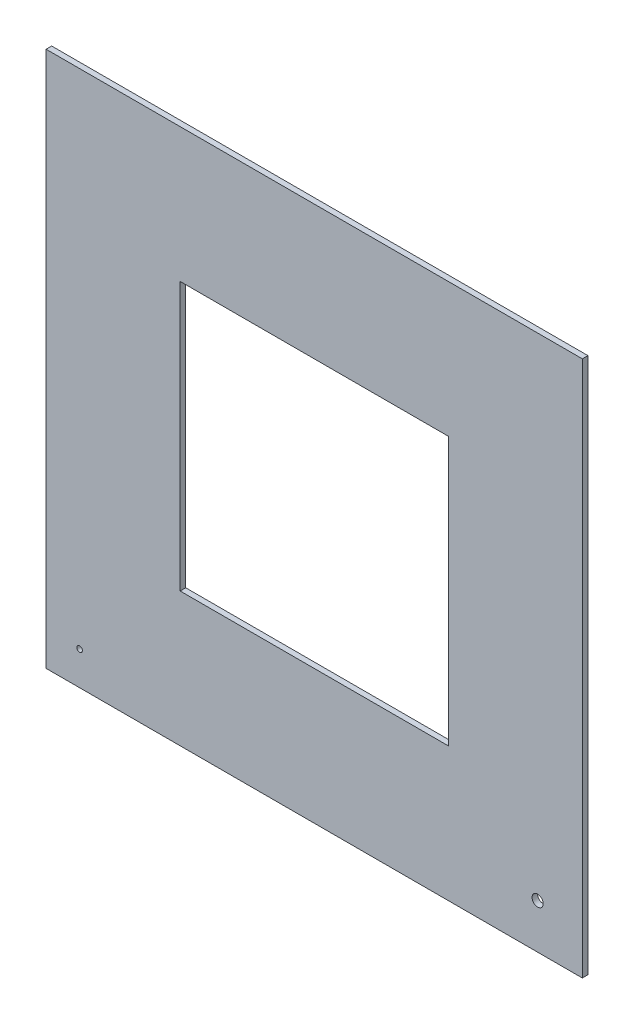
ISO-10303-21;
HEADER;
FILE_DESCRIPTION(('STEP AP214'),'2;1');
FILE_NAME('part.step','',(''),(''),'','','');
FILE_SCHEMA(('AUTOMOTIVE_DESIGN { 1 0 10303 214 1 1 1 1 }'));
ENDSEC;
DATA;
#1=APPLICATION_CONTEXT('core data for automotive mechanical design processes');
#2=APPLICATION_PROTOCOL_DEFINITION('international standard','automotive_design',2000,#1);
#3=PRODUCT_CONTEXT('',#1,'mechanical');
#4=PRODUCT('Part','Part','',(#3));
#5=PRODUCT_RELATED_PRODUCT_CATEGORY('part','',(#4));
#6=PRODUCT_DEFINITION_FORMATION('','',#4);
#7=PRODUCT_DEFINITION_CONTEXT('part definition',#1,'design');
#8=PRODUCT_DEFINITION('design','',#6,#7);
#9=PRODUCT_DEFINITION_SHAPE('','',#8);
#10=(LENGTH_UNIT() NAMED_UNIT(*) SI_UNIT(.MILLI.,.METRE.));
#11=(NAMED_UNIT(*) PLANE_ANGLE_UNIT() SI_UNIT($,.RADIAN.));
#12=(NAMED_UNIT(*) SI_UNIT($,.STERADIAN.) SOLID_ANGLE_UNIT());
#13=UNCERTAINTY_MEASURE_WITH_UNIT(LENGTH_MEASURE(1.E-05),#10,'distance_accuracy_value','');
#14=(GEOMETRIC_REPRESENTATION_CONTEXT(3) GLOBAL_UNCERTAINTY_ASSIGNED_CONTEXT((#13)) GLOBAL_UNIT_ASSIGNED_CONTEXT((#10,
#11,#12)) REPRESENTATION_CONTEXT('',''));
#15=CARTESIAN_POINT('',(0.,0.,0.));
#16=DIRECTION('',(0.,0.,1.));
#17=DIRECTION('',(1.,0.,0.));
#18=AXIS2_PLACEMENT_3D('',#15,#16,#17);
#19=CARTESIAN_POINT('',(304.8,304.8,6.35));
#20=DIRECTION('',(-1.,0.,0.));
#21=DIRECTION('',(0.,-1.,0.));
#22=AXIS2_PLACEMENT_3D('',#19,#20,#21);
#23=PLANE('',#22);
#24=DIRECTION('',(0.,1.,0.));
#25=VECTOR('',#24,1.);
#26=CARTESIAN_POINT('',(304.8,304.8,0.));
#27=LINE('',#26,#25);
#28=CARTESIAN_POINT('',(304.8,-304.8,0.));
#29=VERTEX_POINT('',#28);
#30=CARTESIAN_POINT('',(304.8,304.8,0.));
#31=VERTEX_POINT('',#30);
#32=EDGE_CURVE('E159',#29,#31,#27,.T.);
#33=ORIENTED_EDGE('',*,*,#32,.T.);
#34=DIRECTION('',(0.,0.,-1.));
#35=VECTOR('',#34,1.);
#36=CARTESIAN_POINT('',(304.8,304.8,6.35));
#37=LINE('',#36,#35);
#38=CARTESIAN_POINT('',(304.8,304.8,6.35));
#39=VERTEX_POINT('',#38);
#40=EDGE_CURVE('E11',#39,#31,#37,.T.);
#41=ORIENTED_EDGE('',*,*,#40,.F.);
#42=DIRECTION('',(0.,1.,0.));
#43=VECTOR('',#42,1.);
#44=CARTESIAN_POINT('',(304.8,304.8,6.35));
#45=LINE('',#44,#43);
#46=CARTESIAN_POINT('',(304.8,-304.8,6.35));
#47=VERTEX_POINT('',#46);
#48=EDGE_CURVE('E163',#47,#39,#45,.T.);
#49=ORIENTED_EDGE('',*,*,#48,.F.);
#50=DIRECTION('',(0.,0.,-1.));
#51=VECTOR('',#50,1.);
#52=CARTESIAN_POINT('',(304.8,-304.8,6.35));
#53=LINE('',#52,#51);
#54=EDGE_CURVE('E177',#47,#29,#53,.T.);
#55=ORIENTED_EDGE('',*,*,#54,.T.);
#56=EDGE_LOOP('',(#33,#41,#49,#55));
#57=FACE_BOUND('',#56,.T.);
#58=ADVANCED_FACE('F38',(#57),#23,.F.);
#59=CARTESIAN_POINT('',(-304.8,304.8,6.35));
#60=DIRECTION('',(0.,-1.,0.));
#61=DIRECTION('',(0.,0.,-1.));
#62=AXIS2_PLACEMENT_3D('',#59,#60,#61);
#63=PLANE('',#62);
#64=DIRECTION('',(-1.,0.,0.));
#65=VECTOR('',#64,1.);
#66=CARTESIAN_POINT('',(-304.8,304.8,0.));
#67=LINE('',#66,#65);
#68=CARTESIAN_POINT('',(-304.8,304.8,0.));
#69=VERTEX_POINT('',#68);
#70=EDGE_CURVE('E181',#31,#69,#67,.T.);
#71=ORIENTED_EDGE('',*,*,#70,.T.);
#72=DIRECTION('',(0.,0.,-1.));
#73=VECTOR('',#72,1.);
#74=CARTESIAN_POINT('',(-304.8,304.8,6.35));
#75=LINE('',#74,#73);
#76=CARTESIAN_POINT('',(-304.8,304.8,6.35));
#77=VERTEX_POINT('',#76);
#78=EDGE_CURVE('E46',#77,#69,#75,.T.);
#79=ORIENTED_EDGE('',*,*,#78,.F.);
#80=DIRECTION('',(-1.,0.,0.));
#81=VECTOR('',#80,1.);
#82=CARTESIAN_POINT('',(-304.8,304.8,6.35));
#83=LINE('',#82,#81);
#84=EDGE_CURVE('E167',#39,#77,#83,.T.);
#85=ORIENTED_EDGE('',*,*,#84,.F.);
#86=ORIENTED_EDGE('',*,*,#40,.T.);
#87=EDGE_LOOP('',(#71,#79,#85,#86));
#88=FACE_BOUND('',#87,.T.);
#89=ADVANCED_FACE('F216',(#88),#63,.F.);
#90=CARTESIAN_POINT('',(-304.8,304.8,6.35));
#91=DIRECTION('',(1.,0.,0.));
#92=DIRECTION('',(0.,1.,0.));
#93=AXIS2_PLACEMENT_3D('',#90,#91,#92);
#94=PLANE('',#93);
#95=DIRECTION('',(0.,-1.,0.));
#96=VECTOR('',#95,1.);
#97=CARTESIAN_POINT('',(-304.8,304.8,0.));
#98=LINE('',#97,#96);
#99=CARTESIAN_POINT('',(-304.8,-304.8,0.));
#100=VERTEX_POINT('',#99);
#101=EDGE_CURVE('E184',#69,#100,#98,.T.);
#102=ORIENTED_EDGE('',*,*,#101,.T.);
#103=DIRECTION('',(0.,0.,-1.));
#104=VECTOR('',#103,1.);
#105=CARTESIAN_POINT('',(-304.8,-304.8,6.35));
#106=LINE('',#105,#104);
#107=CARTESIAN_POINT('',(-304.8,-304.8,6.35));
#108=VERTEX_POINT('',#107);
#109=EDGE_CURVE('E192',#108,#100,#106,.T.);
#110=ORIENTED_EDGE('',*,*,#109,.F.);
#111=DIRECTION('',(0.,-1.,0.));
#112=VECTOR('',#111,1.);
#113=CARTESIAN_POINT('',(-304.8,304.8,6.35));
#114=LINE('',#113,#112);
#115=EDGE_CURVE('E171',#77,#108,#114,.T.);
#116=ORIENTED_EDGE('',*,*,#115,.F.);
#117=ORIENTED_EDGE('',*,*,#78,.T.);
#118=EDGE_LOOP('',(#102,#110,#116,#117));
#119=FACE_BOUND('',#118,.T.);
#120=ADVANCED_FACE('F201',(#119),#94,.F.);
#121=CARTESIAN_POINT('',(-304.8,-304.8,6.35));
#122=DIRECTION('',(0.,1.,0.));
#123=DIRECTION('',(0.,0.,1.));
#124=AXIS2_PLACEMENT_3D('',#121,#122,#123);
#125=PLANE('',#124);
#126=DIRECTION('',(1.,0.,0.));
#127=VECTOR('',#126,1.);
#128=CARTESIAN_POINT('',(-304.8,-304.8,0.));
#129=LINE('',#128,#127);
#130=EDGE_CURVE('E168',#100,#29,#129,.T.);
#131=ORIENTED_EDGE('',*,*,#130,.T.);
#132=ORIENTED_EDGE('',*,*,#54,.F.);
#133=DIRECTION('',(1.,0.,0.));
#134=VECTOR('',#133,1.);
#135=CARTESIAN_POINT('',(-304.8,-304.8,6.35));
#136=LINE('',#135,#134);
#137=EDGE_CURVE('E174',#108,#47,#136,.T.);
#138=ORIENTED_EDGE('',*,*,#137,.F.);
#139=ORIENTED_EDGE('',*,*,#109,.T.);
#140=EDGE_LOOP('',(#131,#132,#138,#139));
#141=FACE_BOUND('',#140,.T.);
#142=ADVANCED_FACE('F209',(#141),#125,.F.);
#143=CARTESIAN_POINT('',(0.,0.,6.35));
#144=DIRECTION('',(0.,0.,1.));
#145=DIRECTION('',(1.,0.,0.));
#146=AXIS2_PLACEMENT_3D('',#143,#144,#145);
#147=PLANE('',#146);
#148=CARTESIAN_POINT('',(-266.7,-266.7,6.35));
#149=DIRECTION('',(0.,0.,1.));
#150=DIRECTION('',(1.,0.,0.));
#151=AXIS2_PLACEMENT_3D('',#148,#149,#150);
#152=CIRCLE('',#151,3.17499999999997);
#153=CARTESIAN_POINT('',(-263.525,-266.7,6.35));
#154=VERTEX_POINT('',#153);
#155=EDGE_CURVE('E130',#154,#154,#152,.T.);
#156=ORIENTED_EDGE('',*,*,#155,.F.);
#157=EDGE_LOOP('',(#156));
#158=FACE_BOUND('',#157,.T.);
#159=DIRECTION('',(1.,0.,0.));
#160=VECTOR('',#159,1.);
#161=CARTESIAN_POINT('',(-152.4,-152.4,6.35));
#162=LINE('',#161,#160);
#163=CARTESIAN_POINT('',(-152.4,-152.4,6.35));
#164=VERTEX_POINT('',#163);
#165=CARTESIAN_POINT('',(152.4,-152.4,6.35));
#166=VERTEX_POINT('',#165);
#167=EDGE_CURVE('E53',#164,#166,#162,.T.);
#168=ORIENTED_EDGE('',*,*,#167,.F.);
#169=DIRECTION('',(0.,-1.,0.));
#170=VECTOR('',#169,1.);
#171=CARTESIAN_POINT('',(-152.4,152.4,6.35));
#172=LINE('',#171,#170);
#173=CARTESIAN_POINT('',(-152.4,152.4,6.35));
#174=VERTEX_POINT('',#173);
#175=EDGE_CURVE('E123',#174,#164,#172,.T.);
#176=ORIENTED_EDGE('',*,*,#175,.F.);
#177=DIRECTION('',(1.,0.,0.));
#178=VECTOR('',#177,1.);
#179=CARTESIAN_POINT('',(-152.4,152.4,6.35));
#180=LINE('',#179,#178);
#181=CARTESIAN_POINT('',(152.4,152.4,6.35));
#182=VERTEX_POINT('',#181);
#183=EDGE_CURVE('E127',#174,#182,#180,.T.);
#184=ORIENTED_EDGE('',*,*,#183,.T.);
#185=DIRECTION('',(0.,-1.,0.));
#186=VECTOR('',#185,1.);
#187=CARTESIAN_POINT('',(152.4,152.4,6.35));
#188=LINE('',#187,#186);
#189=EDGE_CURVE('E139',#182,#166,#188,.T.);
#190=ORIENTED_EDGE('',*,*,#189,.T.);
#191=EDGE_LOOP('',(#168,#176,#184,#190));
#192=FACE_BOUND('',#191,.T.);
#193=CARTESIAN_POINT('',(254.,-254.,6.35));
#194=DIRECTION('',(0.,0.,1.));
#195=DIRECTION('',(1.,0.,0.));
#196=AXIS2_PLACEMENT_3D('',#193,#194,#195);
#197=CIRCLE('',#196,6.34999999999999);
#198=CARTESIAN_POINT('',(260.35,-254.,6.35));
#199=VERTEX_POINT('',#198);
#200=EDGE_CURVE('E149',#199,#199,#197,.T.);
#201=ORIENTED_EDGE('',*,*,#200,.F.);
#202=EDGE_LOOP('',(#201));
#203=FACE_BOUND('',#202,.T.);
#204=ORIENTED_EDGE('',*,*,#48,.T.);
#205=ORIENTED_EDGE('',*,*,#84,.T.);
#206=ORIENTED_EDGE('',*,*,#115,.T.);
#207=ORIENTED_EDGE('',*,*,#137,.T.);
#208=EDGE_LOOP('',(#204,#205,#206,#207));
#209=FACE_BOUND('',#208,.T.);
#210=ADVANCED_FACE('F215',(#158,#192,#203,#209),#147,.T.);
#211=CARTESIAN_POINT('',(0.,0.,0.));
#212=DIRECTION('',(0.,0.,1.));
#213=DIRECTION('',(1.,0.,0.));
#214=AXIS2_PLACEMENT_3D('',#211,#212,#213);
#215=PLANE('',#214);
#216=CARTESIAN_POINT('',(-266.7,-266.7,0.));
#217=DIRECTION('',(0.,0.,1.));
#218=DIRECTION('',(1.,0.,0.));
#219=AXIS2_PLACEMENT_3D('',#216,#217,#218);
#220=CIRCLE('',#219,3.17499999999997);
#221=CARTESIAN_POINT('',(-263.525,-266.7,0.));
#222=VERTEX_POINT('',#221);
#223=EDGE_CURVE('E140',#222,#222,#220,.T.);
#224=ORIENTED_EDGE('',*,*,#223,.T.);
#225=EDGE_LOOP('',(#224));
#226=FACE_BOUND('',#225,.T.);
#227=DIRECTION('',(0.,-1.,0.));
#228=VECTOR('',#227,1.);
#229=CARTESIAN_POINT('',(-152.4,152.4,0.));
#230=LINE('',#229,#228);
#231=CARTESIAN_POINT('',(-152.4,152.4,0.));
#232=VERTEX_POINT('',#231);
#233=CARTESIAN_POINT('',(-152.4,-152.4,0.));
#234=VERTEX_POINT('',#233);
#235=EDGE_CURVE('E117',#232,#234,#230,.T.);
#236=ORIENTED_EDGE('',*,*,#235,.T.);
#237=DIRECTION('',(1.,0.,0.));
#238=VECTOR('',#237,1.);
#239=CARTESIAN_POINT('',(-152.4,-152.4,0.));
#240=LINE('',#239,#238);
#241=CARTESIAN_POINT('',(152.4,-152.4,0.));
#242=VERTEX_POINT('',#241);
#243=EDGE_CURVE('E111',#234,#242,#240,.T.);
#244=ORIENTED_EDGE('',*,*,#243,.T.);
#245=DIRECTION('',(0.,-1.,0.));
#246=VECTOR('',#245,1.);
#247=CARTESIAN_POINT('',(152.4,152.4,0.));
#248=LINE('',#247,#246);
#249=CARTESIAN_POINT('',(152.4,152.4,0.));
#250=VERTEX_POINT('',#249);
#251=EDGE_CURVE('E102',#250,#242,#248,.T.);
#252=ORIENTED_EDGE('',*,*,#251,.F.);
#253=DIRECTION('',(1.,0.,0.));
#254=VECTOR('',#253,1.);
#255=CARTESIAN_POINT('',(-152.4,152.4,0.));
#256=LINE('',#255,#254);
#257=EDGE_CURVE('E110',#232,#250,#256,.T.);
#258=ORIENTED_EDGE('',*,*,#257,.F.);
#259=EDGE_LOOP('',(#236,#244,#252,#258));
#260=FACE_BOUND('',#259,.T.);
#261=CARTESIAN_POINT('',(254.,-254.,0.));
#262=DIRECTION('',(0.,0.,1.));
#263=DIRECTION('',(1.,0.,0.));
#264=AXIS2_PLACEMENT_3D('',#261,#262,#263);
#265=CIRCLE('',#264,6.34999999999999);
#266=CARTESIAN_POINT('',(260.35,-254.,0.));
#267=VERTEX_POINT('',#266);
#268=EDGE_CURVE('E155',#267,#267,#265,.T.);
#269=ORIENTED_EDGE('',*,*,#268,.T.);
#270=EDGE_LOOP('',(#269));
#271=FACE_BOUND('',#270,.T.);
#272=ORIENTED_EDGE('',*,*,#32,.F.);
#273=ORIENTED_EDGE('',*,*,#130,.F.);
#274=ORIENTED_EDGE('',*,*,#101,.F.);
#275=ORIENTED_EDGE('',*,*,#70,.F.);
#276=EDGE_LOOP('',(#272,#273,#274,#275));
#277=FACE_BOUND('',#276,.T.);
#278=ADVANCED_FACE('F119',(#226,#260,#271,#277),#215,.F.);
#279=CARTESIAN_POINT('',(254.,-254.,0.));
#280=DIRECTION('',(0.,0.,1.));
#281=DIRECTION('',(1.,0.,0.));
#282=AXIS2_PLACEMENT_3D('',#279,#280,#281);
#283=CYLINDRICAL_SURFACE('',#282,6.34999999999999);
#284=ORIENTED_EDGE('',*,*,#268,.F.);
#285=EDGE_LOOP('',(#284));
#286=FACE_BOUND('',#285,.T.);
#287=ORIENTED_EDGE('',*,*,#200,.T.);
#288=EDGE_LOOP('',(#287));
#289=FACE_BOUND('',#288,.T.);
#290=ADVANCED_FACE('F228',(#286,#289),#283,.F.);
#291=CARTESIAN_POINT('',(-152.4,-152.4,0.));
#292=DIRECTION('',(0.,-1.,0.));
#293=DIRECTION('',(0.,0.,-1.));
#294=AXIS2_PLACEMENT_3D('',#291,#292,#293);
#295=PLANE('',#294);
#296=ORIENTED_EDGE('',*,*,#167,.T.);
#297=DIRECTION('',(0.,0.,1.));
#298=VECTOR('',#297,1.);
#299=CARTESIAN_POINT('',(152.4,-152.4,0.));
#300=LINE('',#299,#298);
#301=EDGE_CURVE('E104',#242,#166,#300,.T.);
#302=ORIENTED_EDGE('',*,*,#301,.F.);
#303=ORIENTED_EDGE('',*,*,#243,.F.);
#304=DIRECTION('',(0.,0.,1.));
#305=VECTOR('',#304,1.);
#306=CARTESIAN_POINT('',(-152.4,-152.4,0.));
#307=LINE('',#306,#305);
#308=EDGE_CURVE('E146',#234,#164,#307,.T.);
#309=ORIENTED_EDGE('',*,*,#308,.T.);
#310=EDGE_LOOP('',(#296,#302,#303,#309));
#311=FACE_BOUND('',#310,.T.);
#312=ADVANCED_FACE('F114',(#311),#295,.F.);
#313=CARTESIAN_POINT('',(-152.4,152.4,0.));
#314=DIRECTION('',(-1.,0.,0.));
#315=DIRECTION('',(0.,-1.,0.));
#316=AXIS2_PLACEMENT_3D('',#313,#314,#315);
#317=PLANE('',#316);
#318=ORIENTED_EDGE('',*,*,#175,.T.);
#319=ORIENTED_EDGE('',*,*,#308,.F.);
#320=ORIENTED_EDGE('',*,*,#235,.F.);
#321=DIRECTION('',(0.,0.,1.));
#322=VECTOR('',#321,1.);
#323=CARTESIAN_POINT('',(-152.4,152.4,0.));
#324=LINE('',#323,#322);
#325=EDGE_CURVE('E150',#232,#174,#324,.T.);
#326=ORIENTED_EDGE('',*,*,#325,.T.);
#327=EDGE_LOOP('',(#318,#319,#320,#326));
#328=FACE_BOUND('',#327,.T.);
#329=ADVANCED_FACE('F238',(#328),#317,.F.);
#330=CARTESIAN_POINT('',(-152.4,152.4,0.));
#331=DIRECTION('',(0.,-1.,0.));
#332=DIRECTION('',(0.,0.,-1.));
#333=AXIS2_PLACEMENT_3D('',#330,#331,#332);
#334=PLANE('',#333);
#335=ORIENTED_EDGE('',*,*,#183,.F.);
#336=ORIENTED_EDGE('',*,*,#325,.F.);
#337=ORIENTED_EDGE('',*,*,#257,.T.);
#338=DIRECTION('',(0.,0.,1.));
#339=VECTOR('',#338,1.);
#340=CARTESIAN_POINT('',(152.4,152.4,0.));
#341=LINE('',#340,#339);
#342=EDGE_CURVE('E61',#250,#182,#341,.T.);
#343=ORIENTED_EDGE('',*,*,#342,.T.);
#344=EDGE_LOOP('',(#335,#336,#337,#343));
#345=FACE_BOUND('',#344,.T.);
#346=ADVANCED_FACE('F242',(#345),#334,.T.);
#347=CARTESIAN_POINT('',(152.4,152.4,0.));
#348=DIRECTION('',(-1.,0.,0.));
#349=DIRECTION('',(0.,-1.,0.));
#350=AXIS2_PLACEMENT_3D('',#347,#348,#349);
#351=PLANE('',#350);
#352=ORIENTED_EDGE('',*,*,#189,.F.);
#353=ORIENTED_EDGE('',*,*,#342,.F.);
#354=ORIENTED_EDGE('',*,*,#251,.T.);
#355=ORIENTED_EDGE('',*,*,#301,.T.);
#356=EDGE_LOOP('',(#352,#353,#354,#355));
#357=FACE_BOUND('',#356,.T.);
#358=ADVANCED_FACE('F103',(#357),#351,.T.);
#359=CARTESIAN_POINT('',(-266.7,-266.7,0.));
#360=DIRECTION('',(0.,0.,1.));
#361=DIRECTION('',(1.,0.,0.));
#362=AXIS2_PLACEMENT_3D('',#359,#360,#361);
#363=CYLINDRICAL_SURFACE('',#362,3.17499999999997);
#364=ORIENTED_EDGE('',*,*,#223,.F.);
#365=EDGE_LOOP('',(#364));
#366=FACE_BOUND('',#365,.T.);
#367=ORIENTED_EDGE('',*,*,#155,.T.);
#368=EDGE_LOOP('',(#367));
#369=FACE_BOUND('',#368,.T.);
#370=ADVANCED_FACE('F241',(#366,#369),#363,.F.);
#371=CLOSED_SHELL('',(#58,#89,#120,#142,#210,#278,#290,#312,#329,#346,#358,#370));
#372=MANIFOLD_SOLID_BREP('B2',#371);
#373=ADVANCED_BREP_SHAPE_REPRESENTATION('',(#18,#372),#14);
#374=SHAPE_DEFINITION_REPRESENTATION(#9,#373);
ENDSEC;
END-ISO-10303-21;
